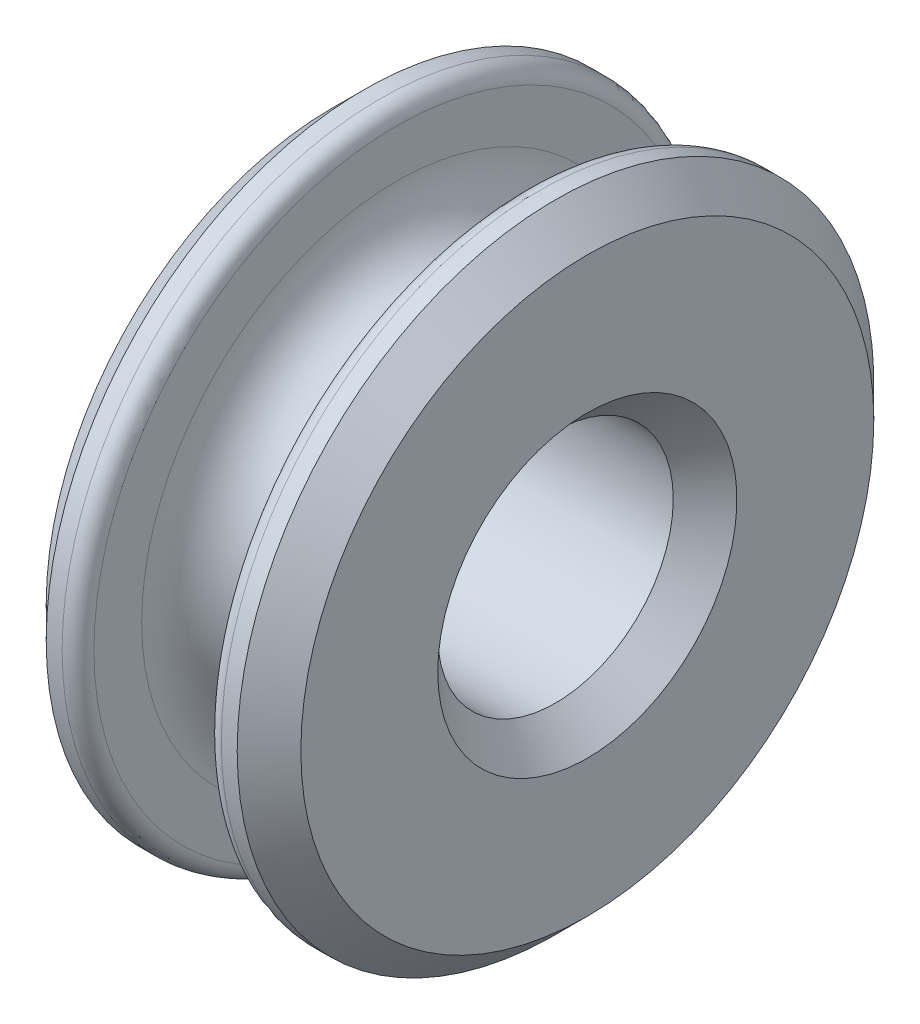
ISO-10303-21;
HEADER;
FILE_DESCRIPTION(('STEP AP214'),'2;1');
FILE_NAME('part.step','',(''),(''),'','','');
FILE_SCHEMA(('AUTOMOTIVE_DESIGN { 1 0 10303 214 1 1 1 1 }'));
ENDSEC;
DATA;
#1=APPLICATION_CONTEXT('core data for automotive mechanical design processes');
#2=APPLICATION_PROTOCOL_DEFINITION('international standard','automotive_design',2000,#1);
#3=PRODUCT_CONTEXT('',#1,'mechanical');
#4=PRODUCT('Part','Part','',(#3));
#5=PRODUCT_RELATED_PRODUCT_CATEGORY('part','',(#4));
#6=PRODUCT_DEFINITION_FORMATION('','',#4);
#7=PRODUCT_DEFINITION_CONTEXT('part definition',#1,'design');
#8=PRODUCT_DEFINITION('design','',#6,#7);
#9=PRODUCT_DEFINITION_SHAPE('','',#8);
#10=(LENGTH_UNIT() NAMED_UNIT(*) SI_UNIT(.MILLI.,.METRE.));
#11=(NAMED_UNIT(*) PLANE_ANGLE_UNIT() SI_UNIT($,.RADIAN.));
#12=(NAMED_UNIT(*) SI_UNIT($,.STERADIAN.) SOLID_ANGLE_UNIT());
#13=UNCERTAINTY_MEASURE_WITH_UNIT(LENGTH_MEASURE(1.E-05),#10,'distance_accuracy_value','');
#14=(GEOMETRIC_REPRESENTATION_CONTEXT(3) GLOBAL_UNCERTAINTY_ASSIGNED_CONTEXT((#13)) GLOBAL_UNIT_ASSIGNED_CONTEXT((#10,
#11,#12)) REPRESENTATION_CONTEXT('',''));
#15=CARTESIAN_POINT('',(0.,0.,0.));
#16=DIRECTION('',(0.,0.,1.));
#17=DIRECTION('',(1.,0.,0.));
#18=AXIS2_PLACEMENT_3D('',#15,#16,#17);
#19=CARTESIAN_POINT('',(0.,0.,0.));
#20=DIRECTION('',(-1.,0.,0.));
#21=DIRECTION('',(0.,0.,1.));
#22=AXIS2_PLACEMENT_3D('',#19,#20,#21);
#23=CYLINDRICAL_SURFACE('',#22,5.);
#24=CARTESIAN_POINT('',(0.500000000000003,0.,0.));
#25=DIRECTION('',(1.,0.,0.));
#26=DIRECTION('',(0.,0.,-1.));
#27=AXIS2_PLACEMENT_3D('',#24,#25,#26);
#28=CIRCLE('',#27,5.);
#29=CARTESIAN_POINT('',(0.500000000000003,0.,-5.));
#30=VERTEX_POINT('',#29);
#31=EDGE_CURVE('E10',#30,#30,#28,.T.);
#32=ORIENTED_EDGE('',*,*,#31,.T.);
#33=EDGE_LOOP('',(#32));
#34=FACE_BOUND('',#33,.T.);
#35=CARTESIAN_POINT('',(0.75,0.,0.));
#36=DIRECTION('',(-1.,0.,0.));
#37=DIRECTION('',(0.,0.,1.));
#38=AXIS2_PLACEMENT_3D('',#35,#36,#37);
#39=CIRCLE('',#38,5.);
#40=CARTESIAN_POINT('',(0.75,0.,5.));
#41=VERTEX_POINT('',#40);
#42=EDGE_CURVE('E77',#41,#41,#39,.T.);
#43=ORIENTED_EDGE('',*,*,#42,.T.);
#44=EDGE_LOOP('',(#43));
#45=FACE_BOUND('',#44,.T.);
#46=ADVANCED_FACE('F41',(#34,#45),#23,.T.);
#47=CARTESIAN_POINT('',(0.,5.,0.));
#48=DIRECTION('',(1.,0.,0.));
#49=DIRECTION('',(0.,0.,-1.));
#50=AXIS2_PLACEMENT_3D('',#47,#48,#49);
#51=PLANE('',#50);
#52=CARTESIAN_POINT('',(0.,0.,0.));
#53=DIRECTION('',(1.,0.,0.));
#54=DIRECTION('',(0.,0.,-1.));
#55=AXIS2_PLACEMENT_3D('',#52,#53,#54);
#56=CIRCLE('',#55,4.5);
#57=CARTESIAN_POINT('',(0.,0.,-4.5));
#58=VERTEX_POINT('',#57);
#59=EDGE_CURVE('E49',#58,#58,#56,.F.);
#60=ORIENTED_EDGE('',*,*,#59,.T.);
#61=EDGE_LOOP('',(#60));
#62=FACE_BOUND('',#61,.T.);
#63=CARTESIAN_POINT('',(0.,0.,0.));
#64=DIRECTION('',(1.,0.,0.));
#65=DIRECTION('',(0.,0.,-1.));
#66=AXIS2_PLACEMENT_3D('',#63,#64,#65);
#67=CIRCLE('',#66,2.35);
#68=CARTESIAN_POINT('',(0.,0.,-2.35));
#69=VERTEX_POINT('',#68);
#70=EDGE_CURVE('E53',#69,#69,#67,.T.);
#71=ORIENTED_EDGE('',*,*,#70,.T.);
#72=EDGE_LOOP('',(#71));
#73=FACE_BOUND('',#72,.T.);
#74=ADVANCED_FACE('F114',(#62,#73),#51,.F.);
#75=CARTESIAN_POINT('',(0.,0.,0.));
#76=DIRECTION('',(-1.,0.,0.));
#77=DIRECTION('',(0.,0.,1.));
#78=AXIS2_PLACEMENT_3D('',#75,#76,#77);
#79=CYLINDRICAL_SURFACE('',#78,1.85);
#80=CARTESIAN_POINT('',(3.5,0.,0.));
#81=DIRECTION('',(-1.,0.,0.));
#82=DIRECTION('',(0.,0.,1.));
#83=AXIS2_PLACEMENT_3D('',#80,#81,#82);
#84=CIRCLE('',#83,1.85);
#85=CARTESIAN_POINT('',(3.5,0.,1.85));
#86=VERTEX_POINT('',#85);
#87=EDGE_CURVE('E62',#86,#86,#84,.F.);
#88=ORIENTED_EDGE('',*,*,#87,.T.);
#89=EDGE_LOOP('',(#88));
#90=FACE_BOUND('',#89,.T.);
#91=CARTESIAN_POINT('',(0.499999999999998,0.,0.));
#92=DIRECTION('',(1.,0.,0.));
#93=DIRECTION('',(0.,0.,-1.));
#94=AXIS2_PLACEMENT_3D('',#91,#92,#93);
#95=CIRCLE('',#94,1.85);
#96=CARTESIAN_POINT('',(0.499999999999998,0.,-1.85));
#97=VERTEX_POINT('',#96);
#98=EDGE_CURVE('E65',#97,#97,#95,.F.);
#99=ORIENTED_EDGE('',*,*,#98,.T.);
#100=EDGE_LOOP('',(#99));
#101=FACE_BOUND('',#100,.T.);
#102=ADVANCED_FACE('F120',(#90,#101),#79,.F.);
#103=CARTESIAN_POINT('',(4.,1.85,0.));
#104=DIRECTION('',(-1.,0.,0.));
#105=DIRECTION('',(0.,0.,1.));
#106=AXIS2_PLACEMENT_3D('',#103,#104,#105);
#107=PLANE('',#106);
#108=CARTESIAN_POINT('',(4.,0.,0.));
#109=DIRECTION('',(-1.,0.,0.));
#110=DIRECTION('',(0.,0.,1.));
#111=AXIS2_PLACEMENT_3D('',#108,#109,#110);
#112=CIRCLE('',#111,2.35);
#113=CARTESIAN_POINT('',(4.,0.,2.35));
#114=VERTEX_POINT('',#113);
#115=EDGE_CURVE('E68',#114,#114,#112,.T.);
#116=ORIENTED_EDGE('',*,*,#115,.T.);
#117=EDGE_LOOP('',(#116));
#118=FACE_BOUND('',#117,.T.);
#119=CARTESIAN_POINT('',(4.,0.,0.));
#120=DIRECTION('',(-1.,0.,0.));
#121=DIRECTION('',(0.,0.,1.));
#122=AXIS2_PLACEMENT_3D('',#119,#120,#121);
#123=CIRCLE('',#122,4.5);
#124=CARTESIAN_POINT('',(4.,0.,4.5));
#125=VERTEX_POINT('',#124);
#126=EDGE_CURVE('E71',#125,#125,#123,.F.);
#127=ORIENTED_EDGE('',*,*,#126,.T.);
#128=EDGE_LOOP('',(#127));
#129=FACE_BOUND('',#128,.T.);
#130=ADVANCED_FACE('F110',(#118,#129),#107,.F.);
#131=CARTESIAN_POINT('',(0.,0.,0.));
#132=DIRECTION('',(-1.,0.,0.));
#133=DIRECTION('',(0.,0.,1.));
#134=AXIS2_PLACEMENT_3D('',#131,#132,#133);
#135=CYLINDRICAL_SURFACE('',#134,5.);
#136=CARTESIAN_POINT('',(3.5,0.,0.));
#137=DIRECTION('',(-1.,0.,0.));
#138=DIRECTION('',(0.,0.,1.));
#139=AXIS2_PLACEMENT_3D('',#136,#137,#138);
#140=CIRCLE('',#139,5.);
#141=CARTESIAN_POINT('',(3.5,0.,5.));
#142=VERTEX_POINT('',#141);
#143=EDGE_CURVE('E57',#142,#142,#140,.T.);
#144=ORIENTED_EDGE('',*,*,#143,.T.);
#145=EDGE_LOOP('',(#144));
#146=FACE_BOUND('',#145,.T.);
#147=CARTESIAN_POINT('',(3.25,0.,0.));
#148=DIRECTION('',(1.,0.,0.));
#149=DIRECTION('',(0.,0.,-1.));
#150=AXIS2_PLACEMENT_3D('',#147,#148,#149);
#151=CIRCLE('',#150,5.);
#152=CARTESIAN_POINT('',(3.25,0.,-5.));
#153=VERTEX_POINT('',#152);
#154=EDGE_CURVE('E80',#153,#153,#151,.T.);
#155=ORIENTED_EDGE('',*,*,#154,.T.);
#156=EDGE_LOOP('',(#155));
#157=FACE_BOUND('',#156,.T.);
#158=ADVANCED_FACE('F103',(#146,#157),#135,.T.);
#159=CARTESIAN_POINT('',(3.,5.,0.));
#160=DIRECTION('',(1.,0.,0.));
#161=DIRECTION('',(0.,0.,-1.));
#162=AXIS2_PLACEMENT_3D('',#159,#160,#161);
#163=PLANE('',#162);
#164=CARTESIAN_POINT('',(3.,0.,0.));
#165=DIRECTION('',(1.,0.,0.));
#166=DIRECTION('',(0.,0.,-1.));
#167=AXIS2_PLACEMENT_3D('',#164,#165,#166);
#168=CIRCLE('',#167,4.75);
#169=CARTESIAN_POINT('',(3.,0.,-4.75));
#170=VERTEX_POINT('',#169);
#171=EDGE_CURVE('E83',#170,#170,#168,.F.);
#172=ORIENTED_EDGE('',*,*,#171,.T.);
#173=EDGE_LOOP('',(#172));
#174=FACE_BOUND('',#173,.T.);
#175=CARTESIAN_POINT('',(3.,0.,0.));
#176=DIRECTION('',(-1.,0.,0.));
#177=DIRECTION('',(0.,0.,1.));
#178=AXIS2_PLACEMENT_3D('',#175,#176,#177);
#179=CIRCLE('',#178,4.);
#180=CARTESIAN_POINT('',(3.,0.,4.));
#181=VERTEX_POINT('',#180);
#182=EDGE_CURVE('E86',#181,#181,#179,.T.);
#183=ORIENTED_EDGE('',*,*,#182,.F.);
#184=EDGE_LOOP('',(#183));
#185=FACE_BOUND('',#184,.T.);
#186=ADVANCED_FACE('F98',(#174,#185),#163,.F.);
#187=CARTESIAN_POINT('',(2.,0.,0.));
#188=DIRECTION('',(-1.,0.,0.));
#189=DIRECTION('',(0.,0.,1.));
#190=AXIS2_PLACEMENT_3D('',#187,#188,#189);
#191=TOROIDAL_SURFACE('',#190,4.,1.);
#192=CARTESIAN_POINT('',(1.,0.,0.));
#193=DIRECTION('',(-1.,0.,0.));
#194=DIRECTION('',(0.,0.,1.));
#195=AXIS2_PLACEMENT_3D('',#192,#193,#194);
#196=CIRCLE('',#195,4.);
#197=CARTESIAN_POINT('',(1.,0.,4.));
#198=VERTEX_POINT('',#197);
#199=EDGE_CURVE('E89',#198,#198,#196,.T.);
#200=ORIENTED_EDGE('',*,*,#199,.F.);
#201=EDGE_LOOP('',(#200));
#202=FACE_BOUND('',#201,.T.);
#203=ORIENTED_EDGE('',*,*,#182,.T.);
#204=EDGE_LOOP('',(#203));
#205=FACE_BOUND('',#204,.T.);
#206=ADVANCED_FACE('F95',(#202,#205),#191,.F.);
#207=CARTESIAN_POINT('',(1.,4.,0.));
#208=DIRECTION('',(-1.,0.,0.));
#209=DIRECTION('',(0.,0.,1.));
#210=AXIS2_PLACEMENT_3D('',#207,#208,#209);
#211=PLANE('',#210);
#212=CARTESIAN_POINT('',(1.,0.,0.));
#213=DIRECTION('',(-1.,0.,0.));
#214=DIRECTION('',(0.,0.,1.));
#215=AXIS2_PLACEMENT_3D('',#212,#213,#214);
#216=CIRCLE('',#215,4.75);
#217=CARTESIAN_POINT('',(1.,0.,4.75));
#218=VERTEX_POINT('',#217);
#219=EDGE_CURVE('E74',#218,#218,#216,.F.);
#220=ORIENTED_EDGE('',*,*,#219,.T.);
#221=EDGE_LOOP('',(#220));
#222=FACE_BOUND('',#221,.T.);
#223=ORIENTED_EDGE('',*,*,#199,.T.);
#224=EDGE_LOOP('',(#223));
#225=FACE_BOUND('',#224,.T.);
#226=ADVANCED_FACE('F93',(#222,#225),#211,.F.);
#227=CARTESIAN_POINT('',(3.25,0.,0.));
#228=DIRECTION('',(1.,0.,0.));
#229=DIRECTION('',(0.,0.,-1.));
#230=AXIS2_PLACEMENT_3D('',#227,#228,#229);
#231=TOROIDAL_SURFACE('',#230,4.75,0.25);
#232=ORIENTED_EDGE('',*,*,#154,.F.);
#233=EDGE_LOOP('',(#232));
#234=FACE_BOUND('',#233,.T.);
#235=ORIENTED_EDGE('',*,*,#171,.F.);
#236=EDGE_LOOP('',(#235));
#237=FACE_BOUND('',#236,.T.);
#238=ADVANCED_FACE('F125',(#234,#237),#231,.T.);
#239=CARTESIAN_POINT('',(0.75,0.,0.));
#240=DIRECTION('',(-1.,0.,0.));
#241=DIRECTION('',(0.,0.,1.));
#242=AXIS2_PLACEMENT_3D('',#239,#240,#241);
#243=TOROIDAL_SURFACE('',#242,4.75,0.25);
#244=ORIENTED_EDGE('',*,*,#219,.F.);
#245=EDGE_LOOP('',(#244));
#246=FACE_BOUND('',#245,.T.);
#247=ORIENTED_EDGE('',*,*,#42,.F.);
#248=EDGE_LOOP('',(#247));
#249=FACE_BOUND('',#248,.T.);
#250=ADVANCED_FACE('F128',(#246,#249),#243,.T.);
#251=CARTESIAN_POINT('',(4.,0.,0.));
#252=DIRECTION('',(1.,0.,0.));
#253=DIRECTION('',(0.,0.,-1.));
#254=AXIS2_PLACEMENT_3D('',#251,#252,#253);
#255=CONICAL_SURFACE('',#254,2.35,0.785398163397446);
#256=ORIENTED_EDGE('',*,*,#87,.F.);
#257=EDGE_LOOP('',(#256));
#258=FACE_BOUND('',#257,.T.);
#259=ORIENTED_EDGE('',*,*,#115,.F.);
#260=EDGE_LOOP('',(#259));
#261=FACE_BOUND('',#260,.T.);
#262=ADVANCED_FACE('F131',(#258,#261),#255,.F.);
#263=CARTESIAN_POINT('',(3.5,0.,0.));
#264=DIRECTION('',(-1.,0.,0.));
#265=DIRECTION('',(0.,0.,1.));
#266=AXIS2_PLACEMENT_3D('',#263,#264,#265);
#267=CONICAL_SURFACE('',#266,5.,0.785398163397449);
#268=ORIENTED_EDGE('',*,*,#126,.F.);
#269=EDGE_LOOP('',(#268));
#270=FACE_BOUND('',#269,.T.);
#271=ORIENTED_EDGE('',*,*,#143,.F.);
#272=EDGE_LOOP('',(#271));
#273=FACE_BOUND('',#272,.T.);
#274=ADVANCED_FACE('F139',(#270,#273),#267,.T.);
#275=CARTESIAN_POINT('',(0.,0.,0.));
#276=DIRECTION('',(1.,0.,0.));
#277=DIRECTION('',(0.,0.,-1.));
#278=AXIS2_PLACEMENT_3D('',#275,#276,#277);
#279=CONICAL_SURFACE('',#278,4.5,0.785398163397445);
#280=ORIENTED_EDGE('',*,*,#31,.F.);
#281=EDGE_LOOP('',(#280));
#282=FACE_BOUND('',#281,.T.);
#283=ORIENTED_EDGE('',*,*,#59,.F.);
#284=EDGE_LOOP('',(#283));
#285=FACE_BOUND('',#284,.T.);
#286=ADVANCED_FACE('F145',(#282,#285),#279,.T.);
#287=CARTESIAN_POINT('',(0.499999999999998,0.,0.));
#288=DIRECTION('',(-1.,0.,0.));
#289=DIRECTION('',(0.,0.,1.));
#290=AXIS2_PLACEMENT_3D('',#287,#288,#289);
#291=CONICAL_SURFACE('',#290,1.85,0.785398163397449);
#292=ORIENTED_EDGE('',*,*,#70,.F.);
#293=EDGE_LOOP('',(#292));
#294=FACE_BOUND('',#293,.T.);
#295=ORIENTED_EDGE('',*,*,#98,.F.);
#296=EDGE_LOOP('',(#295));
#297=FACE_BOUND('',#296,.T.);
#298=ADVANCED_FACE('F44',(#294,#297),#291,.F.);
#299=CLOSED_SHELL('',(#46,#74,#102,#130,#158,#186,#206,#226,#238,#250,#262,#274,#286,#298));
#300=MANIFOLD_SOLID_BREP('B2',#299);
#301=ADVANCED_BREP_SHAPE_REPRESENTATION('',(#18,#300),#14);
#302=SHAPE_DEFINITION_REPRESENTATION(#9,#301);
ENDSEC;
END-ISO-10303-21;
